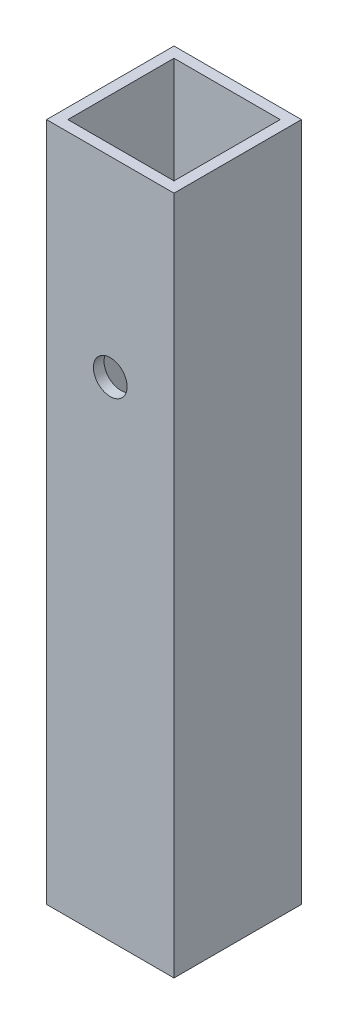
ISO-10303-21;
HEADER;
FILE_DESCRIPTION(('STEP AP214'),'2;1');
FILE_NAME('part.step','',(''),(''),'','','');
FILE_SCHEMA(('AUTOMOTIVE_DESIGN { 1 0 10303 214 1 1 1 1 }'));
ENDSEC;
DATA;
#1=APPLICATION_CONTEXT('core data for automotive mechanical design processes');
#2=APPLICATION_PROTOCOL_DEFINITION('international standard','automotive_design',2000,#1);
#3=PRODUCT_CONTEXT('',#1,'mechanical');
#4=PRODUCT('Part','Part','',(#3));
#5=PRODUCT_RELATED_PRODUCT_CATEGORY('part','',(#4));
#6=PRODUCT_DEFINITION_FORMATION('','',#4);
#7=PRODUCT_DEFINITION_CONTEXT('part definition',#1,'design');
#8=PRODUCT_DEFINITION('design','',#6,#7);
#9=PRODUCT_DEFINITION_SHAPE('','',#8);
#10=(LENGTH_UNIT() NAMED_UNIT(*) SI_UNIT(.MILLI.,.METRE.));
#11=(NAMED_UNIT(*) PLANE_ANGLE_UNIT() SI_UNIT($,.RADIAN.));
#12=(NAMED_UNIT(*) SI_UNIT($,.STERADIAN.) SOLID_ANGLE_UNIT());
#13=UNCERTAINTY_MEASURE_WITH_UNIT(LENGTH_MEASURE(1.E-05),#10,'distance_accuracy_value','');
#14=(GEOMETRIC_REPRESENTATION_CONTEXT(3) GLOBAL_UNCERTAINTY_ASSIGNED_CONTEXT((#13)) GLOBAL_UNIT_ASSIGNED_CONTEXT((#10,
#11,#12)) REPRESENTATION_CONTEXT('',''));
#15=CARTESIAN_POINT('',(0.,0.,0.));
#16=DIRECTION('',(0.,0.,1.));
#17=DIRECTION('',(1.,0.,0.));
#18=AXIS2_PLACEMENT_3D('',#15,#16,#17);
#19=CARTESIAN_POINT('',(0.,203.2,0.));
#20=DIRECTION('',(0.,-1.,0.));
#21=DIRECTION('',(0.,0.,-1.));
#22=AXIS2_PLACEMENT_3D('',#19,#20,#21);
#23=PLANE('',#22);
#24=DIRECTION('',(0.,0.,1.));
#25=VECTOR('',#24,1.);
#26=CARTESIAN_POINT('',(0.,203.2,0.));
#27=LINE('',#26,#25);
#28=CARTESIAN_POINT('',(0.,203.2,-38.1));
#29=VERTEX_POINT('',#28);
#30=CARTESIAN_POINT('',(0.,203.2,0.));
#31=VERTEX_POINT('',#30);
#32=EDGE_CURVE('E136',#29,#31,#27,.T.);
#33=ORIENTED_EDGE('',*,*,#32,.T.);
#34=DIRECTION('',(1.,0.,0.));
#35=VECTOR('',#34,1.);
#36=CARTESIAN_POINT('',(0.,203.2,0.));
#37=LINE('',#36,#35);
#38=CARTESIAN_POINT('',(38.1,203.2,0.));
#39=VERTEX_POINT('',#38);
#40=EDGE_CURVE('E139',#31,#39,#37,.T.);
#41=ORIENTED_EDGE('',*,*,#40,.T.);
#42=DIRECTION('',(0.,0.,-1.));
#43=VECTOR('',#42,1.);
#44=CARTESIAN_POINT('',(38.1,203.2,0.));
#45=LINE('',#44,#43);
#46=CARTESIAN_POINT('',(38.1,203.2,-38.1));
#47=VERTEX_POINT('',#46);
#48=EDGE_CURVE('E142',#39,#47,#45,.T.);
#49=ORIENTED_EDGE('',*,*,#48,.T.);
#50=DIRECTION('',(-1.,0.,0.));
#51=VECTOR('',#50,1.);
#52=CARTESIAN_POINT('',(0.,203.2,-38.1));
#53=LINE('',#52,#51);
#54=EDGE_CURVE('E144',#47,#29,#53,.T.);
#55=ORIENTED_EDGE('',*,*,#54,.T.);
#56=EDGE_LOOP('',(#33,#41,#49,#55));
#57=FACE_BOUND('',#56,.T.);
#58=DIRECTION('',(0.,0.,1.));
#59=VECTOR('',#58,1.);
#60=CARTESIAN_POINT('',(3.175,203.2,-3.175));
#61=LINE('',#60,#59);
#62=CARTESIAN_POINT('',(3.175,203.2,-34.925));
#63=VERTEX_POINT('',#62);
#64=CARTESIAN_POINT('',(3.175,203.2,-3.175));
#65=VERTEX_POINT('',#64);
#66=EDGE_CURVE('E98',#63,#65,#61,.T.);
#67=ORIENTED_EDGE('',*,*,#66,.F.);
#68=DIRECTION('',(-1.,0.,0.));
#69=VECTOR('',#68,1.);
#70=CARTESIAN_POINT('',(3.175,203.2,-34.925));
#71=LINE('',#70,#69);
#72=CARTESIAN_POINT('',(34.925,203.2,-34.925));
#73=VERTEX_POINT('',#72);
#74=EDGE_CURVE('E120',#73,#63,#71,.T.);
#75=ORIENTED_EDGE('',*,*,#74,.F.);
#76=DIRECTION('',(0.,0.,-1.));
#77=VECTOR('',#76,1.);
#78=CARTESIAN_POINT('',(34.925,203.2,-3.175));
#79=LINE('',#78,#77);
#80=CARTESIAN_POINT('',(34.925,203.2,-3.175));
#81=VERTEX_POINT('',#80);
#82=EDGE_CURVE('E118',#81,#73,#79,.T.);
#83=ORIENTED_EDGE('',*,*,#82,.F.);
#84=DIRECTION('',(1.,0.,0.));
#85=VECTOR('',#84,1.);
#86=CARTESIAN_POINT('',(3.175,203.2,-3.175));
#87=LINE('',#86,#85);
#88=EDGE_CURVE('E106',#65,#81,#87,.T.);
#89=ORIENTED_EDGE('',*,*,#88,.F.);
#90=EDGE_LOOP('',(#67,#75,#83,#89));
#91=FACE_BOUND('',#90,.T.);
#92=ADVANCED_FACE('F33',(#57,#91),#23,.F.);
#93=CARTESIAN_POINT('',(0.,0.,0.));
#94=DIRECTION('',(0.,-1.,0.));
#95=DIRECTION('',(0.,0.,-1.));
#96=AXIS2_PLACEMENT_3D('',#93,#94,#95);
#97=PLANE('',#96);
#98=DIRECTION('',(0.,0.,1.));
#99=VECTOR('',#98,1.);
#100=CARTESIAN_POINT('',(0.,0.,0.));
#101=LINE('',#100,#99);
#102=CARTESIAN_POINT('',(0.,0.,-38.1));
#103=VERTEX_POINT('',#102);
#104=CARTESIAN_POINT('',(0.,0.,0.));
#105=VERTEX_POINT('',#104);
#106=EDGE_CURVE('E114',#103,#105,#101,.T.);
#107=ORIENTED_EDGE('',*,*,#106,.F.);
#108=DIRECTION('',(-1.,0.,0.));
#109=VECTOR('',#108,1.);
#110=CARTESIAN_POINT('',(0.,0.,-38.1));
#111=LINE('',#110,#109);
#112=CARTESIAN_POINT('',(38.1,0.,-38.1));
#113=VERTEX_POINT('',#112);
#114=EDGE_CURVE('E140',#113,#103,#111,.T.);
#115=ORIENTED_EDGE('',*,*,#114,.F.);
#116=DIRECTION('',(0.,0.,-1.));
#117=VECTOR('',#116,1.);
#118=CARTESIAN_POINT('',(38.1,0.,0.));
#119=LINE('',#118,#117);
#120=CARTESIAN_POINT('',(38.1,0.,0.));
#121=VERTEX_POINT('',#120);
#122=EDGE_CURVE('E151',#121,#113,#119,.T.);
#123=ORIENTED_EDGE('',*,*,#122,.F.);
#124=DIRECTION('',(1.,0.,0.));
#125=VECTOR('',#124,1.);
#126=CARTESIAN_POINT('',(0.,0.,0.));
#127=LINE('',#126,#125);
#128=EDGE_CURVE('E149',#105,#121,#127,.T.);
#129=ORIENTED_EDGE('',*,*,#128,.F.);
#130=EDGE_LOOP('',(#107,#115,#123,#129));
#131=FACE_BOUND('',#130,.T.);
#132=DIRECTION('',(-1.,0.,0.));
#133=VECTOR('',#132,1.);
#134=CARTESIAN_POINT('',(3.175,0.,-34.925));
#135=LINE('',#134,#133);
#136=CARTESIAN_POINT('',(34.925,0.,-34.925));
#137=VERTEX_POINT('',#136);
#138=CARTESIAN_POINT('',(3.175,0.,-34.925));
#139=VERTEX_POINT('',#138);
#140=EDGE_CURVE('E107',#137,#139,#135,.T.);
#141=ORIENTED_EDGE('',*,*,#140,.T.);
#142=DIRECTION('',(0.,0.,1.));
#143=VECTOR('',#142,1.);
#144=CARTESIAN_POINT('',(3.175,0.,-3.175));
#145=LINE('',#144,#143);
#146=CARTESIAN_POINT('',(3.175,0.,-3.175));
#147=VERTEX_POINT('',#146);
#148=EDGE_CURVE('E56',#139,#147,#145,.T.);
#149=ORIENTED_EDGE('',*,*,#148,.T.);
#150=DIRECTION('',(1.,0.,0.));
#151=VECTOR('',#150,1.);
#152=CARTESIAN_POINT('',(3.175,0.,-3.175));
#153=LINE('',#152,#151);
#154=CARTESIAN_POINT('',(34.925,0.,-3.175));
#155=VERTEX_POINT('',#154);
#156=EDGE_CURVE('E113',#147,#155,#153,.T.);
#157=ORIENTED_EDGE('',*,*,#156,.T.);
#158=DIRECTION('',(0.,0.,-1.));
#159=VECTOR('',#158,1.);
#160=CARTESIAN_POINT('',(34.925,0.,-3.175));
#161=LINE('',#160,#159);
#162=EDGE_CURVE('E128',#155,#137,#161,.T.);
#163=ORIENTED_EDGE('',*,*,#162,.T.);
#164=EDGE_LOOP('',(#141,#149,#157,#163));
#165=FACE_BOUND('',#164,.T.);
#166=ADVANCED_FACE('F169',(#131,#165),#97,.T.);
#167=CARTESIAN_POINT('',(0.,203.2,0.));
#168=DIRECTION('',(1.,0.,0.));
#169=DIRECTION('',(0.,0.,-1.));
#170=AXIS2_PLACEMENT_3D('',#167,#168,#169);
#171=PLANE('',#170);
#172=ORIENTED_EDGE('',*,*,#106,.T.);
#173=DIRECTION('',(0.,-1.,0.));
#174=VECTOR('',#173,1.);
#175=CARTESIAN_POINT('',(0.,203.2,0.));
#176=LINE('',#175,#174);
#177=EDGE_CURVE('E11',#31,#105,#176,.T.);
#178=ORIENTED_EDGE('',*,*,#177,.F.);
#179=ORIENTED_EDGE('',*,*,#32,.F.);
#180=DIRECTION('',(0.,-1.,0.));
#181=VECTOR('',#180,1.);
#182=CARTESIAN_POINT('',(0.,203.2,-38.1));
#183=LINE('',#182,#181);
#184=EDGE_CURVE('E146',#29,#103,#183,.T.);
#185=ORIENTED_EDGE('',*,*,#184,.T.);
#186=EDGE_LOOP('',(#172,#178,#179,#185));
#187=FACE_BOUND('',#186,.T.);
#188=ADVANCED_FACE('F35',(#187),#171,.F.);
#189=CARTESIAN_POINT('',(0.,203.2,0.));
#190=DIRECTION('',(0.,0.,-1.));
#191=DIRECTION('',(-1.,0.,0.));
#192=AXIS2_PLACEMENT_3D('',#189,#190,#191);
#193=PLANE('',#192);
#194=CARTESIAN_POINT('',(19.05,146.05,0.));
#195=DIRECTION('',(0.,0.,1.));
#196=DIRECTION('',(1.,0.,0.));
#197=AXIS2_PLACEMENT_3D('',#194,#195,#196);
#198=CIRCLE('',#197,5.04189999999999);
#199=CARTESIAN_POINT('',(24.0919,146.05,0.));
#200=VERTEX_POINT('',#199);
#201=EDGE_CURVE('E209',#200,#200,#198,.T.);
#202=ORIENTED_EDGE('',*,*,#201,.F.);
#203=EDGE_LOOP('',(#202));
#204=FACE_BOUND('',#203,.T.);
#205=ORIENTED_EDGE('',*,*,#128,.T.);
#206=DIRECTION('',(0.,-1.,0.));
#207=VECTOR('',#206,1.);
#208=CARTESIAN_POINT('',(38.1,203.2,0.));
#209=LINE('',#208,#207);
#210=EDGE_CURVE('E41',#39,#121,#209,.T.);
#211=ORIENTED_EDGE('',*,*,#210,.F.);
#212=ORIENTED_EDGE('',*,*,#40,.F.);
#213=ORIENTED_EDGE('',*,*,#177,.T.);
#214=EDGE_LOOP('',(#205,#211,#212,#213));
#215=FACE_BOUND('',#214,.T.);
#216=ADVANCED_FACE('F179',(#204,#215),#193,.F.);
#217=CARTESIAN_POINT('',(38.1,203.2,0.));
#218=DIRECTION('',(-1.,0.,0.));
#219=DIRECTION('',(0.,0.,1.));
#220=AXIS2_PLACEMENT_3D('',#217,#218,#219);
#221=PLANE('',#220);
#222=ORIENTED_EDGE('',*,*,#122,.T.);
#223=DIRECTION('',(0.,-1.,0.));
#224=VECTOR('',#223,1.);
#225=CARTESIAN_POINT('',(38.1,203.2,-38.1));
#226=LINE('',#225,#224);
#227=EDGE_CURVE('E156',#47,#113,#226,.T.);
#228=ORIENTED_EDGE('',*,*,#227,.F.);
#229=ORIENTED_EDGE('',*,*,#48,.F.);
#230=ORIENTED_EDGE('',*,*,#210,.T.);
#231=EDGE_LOOP('',(#222,#228,#229,#230));
#232=FACE_BOUND('',#231,.T.);
#233=ADVANCED_FACE('F163',(#232),#221,.F.);
#234=CARTESIAN_POINT('',(0.,203.2,-38.1));
#235=DIRECTION('',(0.,0.,1.));
#236=DIRECTION('',(1.,0.,0.));
#237=AXIS2_PLACEMENT_3D('',#234,#235,#236);
#238=PLANE('',#237);
#239=CARTESIAN_POINT('',(19.05,146.05,-38.1));
#240=DIRECTION('',(0.,0.,1.));
#241=DIRECTION('',(1.,0.,0.));
#242=AXIS2_PLACEMENT_3D('',#239,#240,#241);
#243=CIRCLE('',#242,5.04189999999999);
#244=CARTESIAN_POINT('',(24.0919,146.05,-38.1));
#245=VERTEX_POINT('',#244);
#246=EDGE_CURVE('E206',#245,#245,#243,.T.);
#247=ORIENTED_EDGE('',*,*,#246,.T.);
#248=EDGE_LOOP('',(#247));
#249=FACE_BOUND('',#248,.T.);
#250=ORIENTED_EDGE('',*,*,#114,.T.);
#251=ORIENTED_EDGE('',*,*,#184,.F.);
#252=ORIENTED_EDGE('',*,*,#54,.F.);
#253=ORIENTED_EDGE('',*,*,#227,.T.);
#254=EDGE_LOOP('',(#250,#251,#252,#253));
#255=FACE_BOUND('',#254,.T.);
#256=ADVANCED_FACE('F173',(#249,#255),#238,.F.);
#257=CARTESIAN_POINT('',(3.175,203.2,-3.175));
#258=DIRECTION('',(1.,0.,0.));
#259=DIRECTION('',(0.,0.,-1.));
#260=AXIS2_PLACEMENT_3D('',#257,#258,#259);
#261=PLANE('',#260);
#262=ORIENTED_EDGE('',*,*,#148,.F.);
#263=DIRECTION('',(0.,-1.,0.));
#264=VECTOR('',#263,1.);
#265=CARTESIAN_POINT('',(3.175,203.2,-34.925));
#266=LINE('',#265,#264);
#267=EDGE_CURVE('E102',#63,#139,#266,.T.);
#268=ORIENTED_EDGE('',*,*,#267,.F.);
#269=ORIENTED_EDGE('',*,*,#66,.T.);
#270=DIRECTION('',(0.,-1.,0.));
#271=VECTOR('',#270,1.);
#272=CARTESIAN_POINT('',(3.175,203.2,-3.175));
#273=LINE('',#272,#271);
#274=EDGE_CURVE('E101',#65,#147,#273,.T.);
#275=ORIENTED_EDGE('',*,*,#274,.T.);
#276=EDGE_LOOP('',(#262,#268,#269,#275));
#277=FACE_BOUND('',#276,.T.);
#278=ADVANCED_FACE('F100',(#277),#261,.T.);
#279=CARTESIAN_POINT('',(3.175,203.2,-3.175));
#280=DIRECTION('',(0.,0.,-1.));
#281=DIRECTION('',(-1.,0.,0.));
#282=AXIS2_PLACEMENT_3D('',#279,#280,#281);
#283=PLANE('',#282);
#284=CARTESIAN_POINT('',(19.05,146.05,-3.175));
#285=DIRECTION('',(0.,0.,-1.));
#286=DIRECTION('',(-1.,0.,0.));
#287=AXIS2_PLACEMENT_3D('',#284,#285,#286);
#288=CIRCLE('',#287,5.04189999999999);
#289=CARTESIAN_POINT('',(14.0081,146.05,-3.175));
#290=VERTEX_POINT('',#289);
#291=EDGE_CURVE('E126',#290,#290,#288,.T.);
#292=ORIENTED_EDGE('',*,*,#291,.F.);
#293=EDGE_LOOP('',(#292));
#294=FACE_BOUND('',#293,.T.);
#295=ORIENTED_EDGE('',*,*,#156,.F.);
#296=ORIENTED_EDGE('',*,*,#274,.F.);
#297=ORIENTED_EDGE('',*,*,#88,.T.);
#298=DIRECTION('',(0.,-1.,0.));
#299=VECTOR('',#298,1.);
#300=CARTESIAN_POINT('',(34.925,203.2,-3.175));
#301=LINE('',#300,#299);
#302=EDGE_CURVE('E115',#81,#155,#301,.T.);
#303=ORIENTED_EDGE('',*,*,#302,.T.);
#304=EDGE_LOOP('',(#295,#296,#297,#303));
#305=FACE_BOUND('',#304,.T.);
#306=ADVANCED_FACE('F110',(#294,#305),#283,.T.);
#307=CARTESIAN_POINT('',(34.925,203.2,-3.175));
#308=DIRECTION('',(-1.,0.,0.));
#309=DIRECTION('',(0.,0.,1.));
#310=AXIS2_PLACEMENT_3D('',#307,#308,#309);
#311=PLANE('',#310);
#312=ORIENTED_EDGE('',*,*,#162,.F.);
#313=ORIENTED_EDGE('',*,*,#302,.F.);
#314=ORIENTED_EDGE('',*,*,#82,.T.);
#315=DIRECTION('',(0.,-1.,0.));
#316=VECTOR('',#315,1.);
#317=CARTESIAN_POINT('',(34.925,203.2,-34.925));
#318=LINE('',#317,#316);
#319=EDGE_CURVE('E48',#73,#137,#318,.T.);
#320=ORIENTED_EDGE('',*,*,#319,.T.);
#321=EDGE_LOOP('',(#312,#313,#314,#320));
#322=FACE_BOUND('',#321,.T.);
#323=ADVANCED_FACE('F221',(#322),#311,.T.);
#324=CARTESIAN_POINT('',(3.175,203.2,-34.925));
#325=DIRECTION('',(0.,0.,1.));
#326=DIRECTION('',(1.,0.,0.));
#327=AXIS2_PLACEMENT_3D('',#324,#325,#326);
#328=PLANE('',#327);
#329=CARTESIAN_POINT('',(19.05,146.05,-34.925));
#330=DIRECTION('',(0.,0.,1.));
#331=DIRECTION('',(1.,0.,0.));
#332=AXIS2_PLACEMENT_3D('',#329,#330,#331);
#333=CIRCLE('',#332,5.04189999999999);
#334=CARTESIAN_POINT('',(24.0919,146.05,-34.925));
#335=VERTEX_POINT('',#334);
#336=EDGE_CURVE('E208',#335,#335,#333,.T.);
#337=ORIENTED_EDGE('',*,*,#336,.F.);
#338=EDGE_LOOP('',(#337));
#339=FACE_BOUND('',#338,.T.);
#340=ORIENTED_EDGE('',*,*,#140,.F.);
#341=ORIENTED_EDGE('',*,*,#319,.F.);
#342=ORIENTED_EDGE('',*,*,#74,.T.);
#343=ORIENTED_EDGE('',*,*,#267,.T.);
#344=EDGE_LOOP('',(#340,#341,#342,#343));
#345=FACE_BOUND('',#344,.T.);
#346=ADVANCED_FACE('F226',(#339,#345),#328,.T.);
#347=CARTESIAN_POINT('',(19.05,146.05,0.));
#348=DIRECTION('',(0.,0.,1.));
#349=DIRECTION('',(1.,0.,0.));
#350=AXIS2_PLACEMENT_3D('',#347,#348,#349);
#351=CYLINDRICAL_SURFACE('',#350,5.04189999999999);
#352=ORIENTED_EDGE('',*,*,#336,.T.);
#353=EDGE_LOOP('',(#352));
#354=FACE_BOUND('',#353,.T.);
#355=ORIENTED_EDGE('',*,*,#246,.F.);
#356=EDGE_LOOP('',(#355));
#357=FACE_BOUND('',#356,.T.);
#358=ADVANCED_FACE('F231',(#354,#357),#351,.F.);
#359=ORIENTED_EDGE('',*,*,#291,.T.);
#360=EDGE_LOOP('',(#359));
#361=FACE_BOUND('',#360,.T.);
#362=ORIENTED_EDGE('',*,*,#201,.T.);
#363=EDGE_LOOP('',(#362));
#364=FACE_BOUND('',#363,.T.);
#365=ADVANCED_FACE('F218',(#361,#364),#351,.F.);
#366=CLOSED_SHELL('',(#92,#166,#188,#216,#233,#256,#278,#306,#323,#346,#358,#365));
#367=MANIFOLD_SOLID_BREP('B2',#366);
#368=ADVANCED_BREP_SHAPE_REPRESENTATION('',(#18,#367),#14);
#369=SHAPE_DEFINITION_REPRESENTATION(#9,#368);
ENDSEC;
END-ISO-10303-21;
